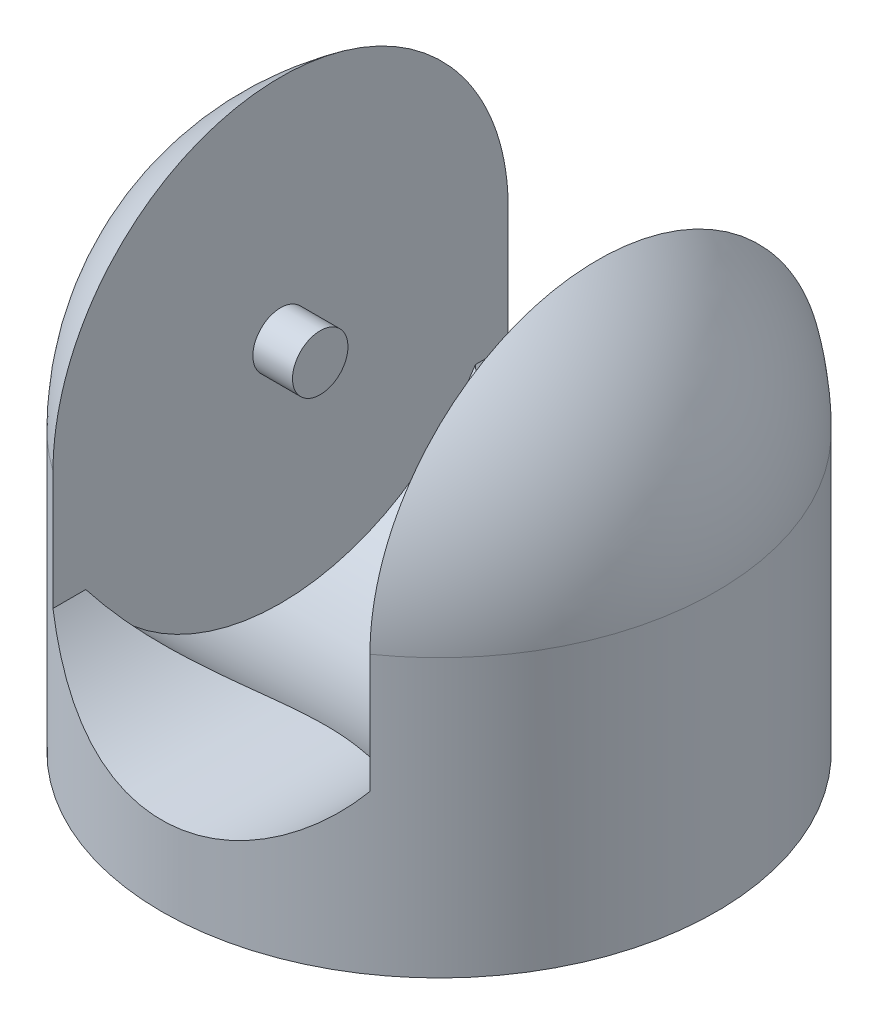
ISO-10303-21;
HEADER;
FILE_DESCRIPTION(('STEP AP214'),'2;1');
FILE_NAME('part.step','',(''),(''),'','','');
FILE_SCHEMA(('AUTOMOTIVE_DESIGN { 1 0 10303 214 1 1 1 1 }'));
ENDSEC;
DATA;
#1=APPLICATION_CONTEXT('core data for automotive mechanical design processes');
#2=APPLICATION_PROTOCOL_DEFINITION('international standard','automotive_design',2000,#1);
#3=PRODUCT_CONTEXT('',#1,'mechanical');
#4=PRODUCT('Part','Part','',(#3));
#5=PRODUCT_RELATED_PRODUCT_CATEGORY('part','',(#4));
#6=PRODUCT_DEFINITION_FORMATION('','',#4);
#7=PRODUCT_DEFINITION_CONTEXT('part definition',#1,'design');
#8=PRODUCT_DEFINITION('design','',#6,#7);
#9=PRODUCT_DEFINITION_SHAPE('','',#8);
#10=(LENGTH_UNIT() NAMED_UNIT(*) SI_UNIT(.MILLI.,.METRE.));
#11=(NAMED_UNIT(*) PLANE_ANGLE_UNIT() SI_UNIT($,.RADIAN.));
#12=(NAMED_UNIT(*) SI_UNIT($,.STERADIAN.) SOLID_ANGLE_UNIT());
#13=UNCERTAINTY_MEASURE_WITH_UNIT(LENGTH_MEASURE(1.E-05),#10,'distance_accuracy_value','');
#14=(GEOMETRIC_REPRESENTATION_CONTEXT(3) GLOBAL_UNCERTAINTY_ASSIGNED_CONTEXT((#13)) GLOBAL_UNIT_ASSIGNED_CONTEXT((#10,
#11,#12)) REPRESENTATION_CONTEXT('',''));
#15=CARTESIAN_POINT('',(0.,0.,0.));
#16=DIRECTION('',(0.,0.,1.));
#17=DIRECTION('',(1.,0.,0.));
#18=AXIS2_PLACEMENT_3D('',#15,#16,#17);
#19=CARTESIAN_POINT('',(-4.57186783672045,31.8336218048073,-6.56611171593209));
#20=DIRECTION('',(-1.,0.,0.));
#21=DIRECTION('',(0.,0.,1.));
#22=AXIS2_PLACEMENT_3D('',#19,#20,#21);
#23=PLANE('',#22);
#24=DIRECTION('',(0.,-1.,0.));
#25=VECTOR('',#24,1.);
#26=CARTESIAN_POINT('',(-4.57186783672045,31.8336218048073,6.56595849405385));
#27=LINE('',#26,#25);
#28=CARTESIAN_POINT('',(-4.57186783672044,23.8326218048073,6.56595849405385));
#29=VERTEX_POINT('',#28);
#30=CARTESIAN_POINT('',(-4.57186783672044,20.4036218048073,6.56595849405385));
#31=VERTEX_POINT('',#30);
#32=EDGE_CURVE('E123',#29,#31,#27,.T.);
#33=ORIENTED_EDGE('',*,*,#32,.T.);
#34=DIRECTION('',(0.,0.,1.));
#35=VECTOR('',#34,1.);
#36=CARTESIAN_POINT('',(-4.57186783672045,20.4036218048073,-8.00130521093912));
#37=LINE('',#36,#35);
#38=CARTESIAN_POINT('',(-4.57186783672045,20.4036218048073,5.6198563165248));
#39=VERTEX_POINT('',#38);
#40=EDGE_CURVE('E111',#39,#31,#37,.T.);
#41=ORIENTED_EDGE('',*,*,#40,.F.);
#42=CARTESIAN_POINT('',(-4.57186783672045,23.8326218048073,-7.66109391214379E-05));
#43=DIRECTION('',(1.,0.,0.));
#44=DIRECTION('',(0.,0.,-1.));
#45=AXIS2_PLACEMENT_3D('',#42,#43,#44);
#46=CIRCLE('',#45,6.58344037029221);
#47=CARTESIAN_POINT('',(-4.57186783672045,20.4036218048073,-5.62000953840304));
#48=VERTEX_POINT('',#47);
#49=EDGE_CURVE('E96',#39,#48,#46,.T.);
#50=ORIENTED_EDGE('',*,*,#49,.T.);
#51=CARTESIAN_POINT('',(-4.57186783672044,20.4036218048073,-6.56611171593209));
#52=VERTEX_POINT('',#51);
#53=EDGE_CURVE('E105',#52,#48,#37,.T.);
#54=ORIENTED_EDGE('',*,*,#53,.F.);
#55=DIRECTION('',(0.,-1.,0.));
#56=VECTOR('',#55,1.);
#57=CARTESIAN_POINT('',(-4.57186783672045,31.8336218048073,-6.56611171593209));
#58=LINE('',#57,#56);
#59=CARTESIAN_POINT('',(-4.57186783672045,23.8326218048073,-6.56611171593209));
#60=VERTEX_POINT('',#59);
#61=EDGE_CURVE('E59',#60,#52,#58,.T.);
#62=ORIENTED_EDGE('',*,*,#61,.F.);
#63=CARTESIAN_POINT('',(-4.57186783672044,23.8326218048073,-7.66109391198517E-05));
#64=DIRECTION('',(-1.,0.,0.));
#65=DIRECTION('',(0.,0.,1.));
#66=AXIS2_PLACEMENT_3D('',#63,#64,#65);
#67=CIRCLE('',#66,6.56603510499297);
#68=EDGE_CURVE('E132',#60,#29,#67,.F.);
#69=ORIENTED_EDGE('',*,*,#68,.T.);
#70=EDGE_LOOP('',(#33,#41,#50,#54,#62,#69));
#71=FACE_BOUND('',#70,.T.);
#72=CARTESIAN_POINT('',(-4.57186783672045,23.8326218048073,-7.66109391198517E-05));
#73=DIRECTION('',(-1.,0.,0.));
#74=DIRECTION('',(0.,0.,1.));
#75=AXIS2_PLACEMENT_3D('',#72,#73,#74);
#76=CIRCLE('',#75,0.8001);
#77=CARTESIAN_POINT('',(-4.57186783672045,23.8326218048073,0.80002338906088));
#78=VERTEX_POINT('',#77);
#79=EDGE_CURVE('E11',#78,#78,#76,.F.);
#80=ORIENTED_EDGE('',*,*,#79,.F.);
#81=EDGE_LOOP('',(#80));
#82=FACE_BOUND('',#81,.T.);
#83=ADVANCED_FACE('F36',(#71,#82),#23,.F.);
#84=CARTESIAN_POINT('',(4.57213216327955,31.8336218048073,-6.56611171593209));
#85=DIRECTION('',(1.,0.,0.));
#86=DIRECTION('',(0.,0.,-1.));
#87=AXIS2_PLACEMENT_3D('',#84,#85,#86);
#88=PLANE('',#87);
#89=DIRECTION('',(0.,-1.,0.));
#90=VECTOR('',#89,1.);
#91=CARTESIAN_POINT('',(4.57213216327955,31.8336218048073,-6.56611171593209));
#92=LINE('',#91,#90);
#93=CARTESIAN_POINT('',(4.57213216327955,23.8326218048073,-6.56611171593209));
#94=VERTEX_POINT('',#93);
#95=CARTESIAN_POINT('',(4.57213216327955,20.4036218048073,-6.56611171593209));
#96=VERTEX_POINT('',#95);
#97=EDGE_CURVE('E110',#94,#96,#92,.T.);
#98=ORIENTED_EDGE('',*,*,#97,.T.);
#99=DIRECTION('',(0.,0.,1.));
#100=VECTOR('',#99,1.);
#101=CARTESIAN_POINT('',(4.57213216327955,20.4036218048073,-8.00130521093912));
#102=LINE('',#101,#100);
#103=CARTESIAN_POINT('',(4.57213216327956,20.4036218048073,-5.62000953840304));
#104=VERTEX_POINT('',#103);
#105=EDGE_CURVE('E103',#96,#104,#102,.T.);
#106=ORIENTED_EDGE('',*,*,#105,.T.);
#107=CARTESIAN_POINT('',(4.57213216327956,23.8326218048073,-7.66109391225424E-05));
#108=DIRECTION('',(1.,0.,0.));
#109=DIRECTION('',(0.,0.,-1.));
#110=AXIS2_PLACEMENT_3D('',#107,#108,#109);
#111=CIRCLE('',#110,6.58344037029221);
#112=CARTESIAN_POINT('',(4.57213216327955,20.4036218048073,5.6198563165248));
#113=VERTEX_POINT('',#112);
#114=EDGE_CURVE('E51',#113,#104,#111,.T.);
#115=ORIENTED_EDGE('',*,*,#114,.F.);
#116=CARTESIAN_POINT('',(4.57213216327955,20.4036218048073,6.56595849405385));
#117=VERTEX_POINT('',#116);
#118=EDGE_CURVE('E112',#113,#117,#102,.T.);
#119=ORIENTED_EDGE('',*,*,#118,.T.);
#120=DIRECTION('',(0.,-1.,0.));
#121=VECTOR('',#120,1.);
#122=CARTESIAN_POINT('',(4.57213216327956,31.8336218048073,6.56595849405385));
#123=LINE('',#122,#121);
#124=CARTESIAN_POINT('',(4.57213216327955,23.8326218048073,6.56595849405385));
#125=VERTEX_POINT('',#124);
#126=EDGE_CURVE('E118',#125,#117,#123,.T.);
#127=ORIENTED_EDGE('',*,*,#126,.F.);
#128=CARTESIAN_POINT('',(4.57213216327955,23.8326218048073,-7.66109391209562E-05));
#129=DIRECTION('',(1.,0.,0.));
#130=DIRECTION('',(0.,0.,-1.));
#131=AXIS2_PLACEMENT_3D('',#128,#129,#130);
#132=CIRCLE('',#131,6.56603510499297);
#133=EDGE_CURVE('E134',#125,#94,#132,.F.);
#134=ORIENTED_EDGE('',*,*,#133,.T.);
#135=EDGE_LOOP('',(#98,#106,#115,#119,#127,#134));
#136=FACE_BOUND('',#135,.T.);
#137=CARTESIAN_POINT('',(4.57213216327955,23.8326218048073,-7.66109391209562E-05));
#138=DIRECTION('',(1.,0.,0.));
#139=DIRECTION('',(0.,0.,-1.));
#140=AXIS2_PLACEMENT_3D('',#137,#138,#139);
#141=CIRCLE('',#140,0.8001);
#142=CARTESIAN_POINT('',(4.57213216327955,23.8326218048073,-0.800176610939121));
#143=VERTEX_POINT('',#142);
#144=EDGE_CURVE('E44',#143,#143,#141,.F.);
#145=ORIENTED_EDGE('',*,*,#144,.F.);
#146=EDGE_LOOP('',(#145));
#147=FACE_BOUND('',#146,.T.);
#148=ADVANCED_FACE('F107',(#136,#147),#88,.F.);
#149=CARTESIAN_POINT('',(0.000132163279554029,23.8326218048073,-8.00130521093912));
#150=DIRECTION('',(0.,0.,1.));
#151=DIRECTION('',(1.,0.,0.));
#152=AXIS2_PLACEMENT_3D('',#149,#150,#151);
#153=CYLINDRICAL_SURFACE('',#152,5.715);
#154=CARTESIAN_POINT('',(4.57213216327956,20.4036218048073,-5.62000953840304));
#155=CARTESIAN_POINT('',(4.46187387850349,20.2566852475342,-5.53037015461616));
#156=CARTESIAN_POINT('',(4.3457878819167,20.1165901241571,-5.43697290801031));
#157=CARTESIAN_POINT('',(4.10295298374768,19.8500728341516,-5.24487514427183));
#158=CARTESIAN_POINT('',(3.97620967313423,19.7236435768166,-5.14617741754067));
#159=CARTESIAN_POINT('',(3.71186332845372,19.4833200916054,-4.94477610392658));
#160=CARTESIAN_POINT('',(3.57418023409407,19.3695363757518,-4.8420464326243));
#161=CARTESIAN_POINT('',(3.28923801537672,19.1555749465828,-4.63569773895956));
#162=CARTESIAN_POINT('',(3.14197928832171,19.055396669296,-4.53207875365028));
#163=CARTESIAN_POINT('',(2.87552723227134,18.8918398549618,-4.35223243709056));
#164=CARTESIAN_POINT('',(2.75842791052056,18.8254955521383,-4.27558347688336));
#165=CARTESIAN_POINT('',(2.51852813606625,18.7006443250377,-4.12488664139121));
#166=CARTESIAN_POINT('',(2.39572885422772,18.6421358006737,-4.05083823735116));
#167=CARTESIAN_POINT('',(2.14434606431652,18.5333499516859,-3.90743842066485));
#168=CARTESIAN_POINT('',(2.01577860494701,18.4830513999735,-3.8380751759613));
#169=CARTESIAN_POINT('',(1.75217211785867,18.3910180729562,-3.70643416352567));
#170=CARTESIAN_POINT('',(1.61713721149171,18.3492779311043,-3.64415196660992));
#171=CARTESIAN_POINT('',(1.31408385692659,18.2681094704148,-3.51922519790924));
#172=CARTESIAN_POINT('',(1.14463778094293,18.2305916494721,-3.4587145847365));
#173=CARTESIAN_POINT('',(0.79691775983565,18.1707143803159,-3.35982979505504));
#174=CARTESIAN_POINT('',(0.618670390961418,18.1483119736887,-3.32139293109974));
#175=CARTESIAN_POINT('',(0.346460203585758,18.1273823255636,-3.28520903401563));
#176=CARTESIAN_POINT('',(0.254335130770877,18.1225282119759,-3.27674192914511));
#177=CARTESIAN_POINT('',(0.0695551943992941,18.1172978465821,-3.26761347825821));
#178=CARTESIAN_POINT('',(-0.0230996300055934,18.1169212680321,-3.26695156266545));
#179=CARTESIAN_POINT('',(-0.208072364894372,18.1206656598221,-3.27349302869336));
#180=CARTESIAN_POINT('',(-0.300390108325046,18.1247886185373,-3.28069988757795));
#181=CARTESIAN_POINT('',(-0.483871490169672,18.1374107010838,-3.30256273529336));
#182=CARTESIAN_POINT('',(-0.575034440364175,18.1459123193281,-3.31722297006477));
#183=CARTESIAN_POINT('',(-0.770627461835221,18.1688417096964,-3.35624625073993));
#184=CARTESIAN_POINT('',(-0.874725451927421,18.1840229881755,-3.3818222708444));
#185=CARTESIAN_POINT('',(-1.07987052630679,18.2196300937725,-3.44059796620617));
#186=CARTESIAN_POINT('',(-1.18091503188239,18.2400602225097,-3.47380389207296));
#187=CARTESIAN_POINT('',(-1.37998271481951,18.2858230386565,-3.54642051614258));
#188=CARTESIAN_POINT('',(-1.47799447624548,18.3111721269164,-3.585851886952));
#189=CARTESIAN_POINT('',(-1.67060915854622,18.3663724258302,-3.66945246213082));
#190=CARTESIAN_POINT('',(-1.76521284375485,18.3962226191291,-3.71362059523134));
#191=CARTESIAN_POINT('',(-2.01815992226182,18.4831956979442,-3.83863917809185));
#192=CARTESIAN_POINT('',(-2.17334626896495,18.5444790457216,-3.92300150409558));
#193=CARTESIAN_POINT('',(-2.47499386041221,18.6787639593691,-4.09783572032648));
#194=CARTESIAN_POINT('',(-2.62144867138352,18.7517740231712,-4.18831201337319));
#195=CARTESIAN_POINT('',(-2.90618276957018,18.9091071186027,-4.37218466242924));
#196=CARTESIAN_POINT('',(-3.0444631379859,18.9934286492652,-4.46558062975559));
#197=CARTESIAN_POINT('',(-3.31306171799542,19.1732141836919,-4.6528691275784));
#198=CARTESIAN_POINT('',(-3.44338305586208,19.2686737690317,-4.74676144715721));
#199=CARTESIAN_POINT('',(-3.75510072636047,19.5180213115988,-4.97667308988142));
#200=CARTESIAN_POINT('',(-3.93198269342912,19.6784006484207,-5.11192448146004));
#201=CARTESIAN_POINT('',(-4.18307371327773,19.9369342776569,-5.30827873899445));
#202=CARTESIAN_POINT('',(-4.26430592310577,20.0259836174216,-5.37256661873096));
#203=CARTESIAN_POINT('',(-4.42185821427533,20.2102048350139,-5.49845997670177));
#204=CARTESIAN_POINT('',(-4.49817598303775,20.3053795537348,-5.56006418773968));
#205=CARTESIAN_POINT('',(-4.57186783672045,20.4036218048073,-5.62000953840304));
#206=B_SPLINE_CURVE_WITH_KNOTS('',3,(#154,#155,#156,#157,#158,#159,#160,#161,#162,#163,#164,
#165,#166,#167,#168,#169,#170,#171,#172,#173,#174,#175,#176,#177,#178,#179,#180,#181,#182,#183,
#184,#185,#186,#187,#188,#189,#190,#191,#192,#193,#194,#195,#196,#197,#198,#199,#200,#201,#202,
#203,#204,#205),.UNSPECIFIED.,.F.,.F.,(4,2,2,2,2,2,2,2,2,2,2,2,2,2,2,2,2,2,2,2,2,2,2,2,2,4),(0.,
0.612810014522095,1.22530052290379,1.84278088953668,2.46023565261067,2.92459973679603,
3.38886885153179,3.85191789175661,4.31467568329198,4.8644476564025,5.4126505062687,
5.69018726195104,5.96770376452344,6.24534295314193,6.52314048109657,6.84741489398671,
7.17195591374848,7.49759821493089,7.82316702335746,8.38317719481423,8.94359503192337,
9.50393857821987,10.0640605892982,10.8853207901664,11.2949268386783,11.7047242470596),.UNSPECIFIED.);
#207=EDGE_CURVE('E90',#104,#48,#206,.T.);
#208=ORIENTED_EDGE('',*,*,#207,.F.);
#209=ORIENTED_EDGE('',*,*,#105,.F.);
#210=CARTESIAN_POINT('',(4.57213216327956,20.4036218048073,-6.56611171593209));
#211=CARTESIAN_POINT('',(4.4746559325398,20.2736910840838,-6.63400363021865));
#212=CARTESIAN_POINT('',(4.37179243314487,20.1480456456083,-6.70238786733606));
#213=CARTESIAN_POINT('',(4.15550006441228,19.9057138327933,-6.83858492151414));
#214=CARTESIAN_POINT('',(4.04206491865612,19.7890328566413,-6.90639737271691));
#215=CARTESIAN_POINT('',(3.80375223966296,19.5640387731431,-7.04048690190543));
#216=CARTESIAN_POINT('',(3.67877025286319,19.4558226200812,-7.10674140973968));
#217=CARTESIAN_POINT('',(3.41868579619101,19.2498021552409,-7.2354435253314));
#218=CARTESIAN_POINT('',(3.28358482959208,19.1519963021168,-7.29789169606719));
#219=CARTESIAN_POINT('',(3.00297480032949,18.9671804741064,-7.41778040597541));
#220=CARTESIAN_POINT('',(2.85741733344583,18.8802265876315,-7.4751945065604));
#221=CARTESIAN_POINT('',(2.55715909537866,18.718730493987,-7.58315344323584));
#222=CARTESIAN_POINT('',(2.40246004941343,18.6441859549708,-7.63369956956189));
#223=CARTESIAN_POINT('',(2.08549341416024,18.5088958046853,-7.72629254189141));
#224=CARTESIAN_POINT('',(1.9232599672923,18.4480941095009,-7.76837385203307));
#225=CARTESIAN_POINT('',(1.59194176260776,18.3410235785492,-7.84296827598671));
#226=CARTESIAN_POINT('',(1.42285873074591,18.2947511071176,-7.87548378333184));
#227=CARTESIAN_POINT('',(1.10425099058226,18.2232690751801,-7.92592499792437));
#228=CARTESIAN_POINT('',(0.955414440896752,18.1959863728852,-7.94527711694353));
#229=CARTESIAN_POINT('',(0.655219270875694,18.1532680865494,-7.97563973133785));
#230=CARTESIAN_POINT('',(0.503861086227046,18.1378304771698,-7.98665165276138));
#231=CARTESIAN_POINT('',(0.199990973415809,18.1190887897849,-8.0000261544256));
#232=CARTESIAN_POINT('',(0.0474788710934799,18.1157865815083,-8.00238740183723));
#233=CARTESIAN_POINT('',(-0.257199950556427,18.1213860565831,-7.99838799951632));
#234=CARTESIAN_POINT('',(-0.409366697098464,18.1302867423399,-7.99202806274631));
#235=CARTESIAN_POINT('',(-0.691883221737035,18.1581397775773,-7.97218066523898));
#236=CARTESIAN_POINT('',(-0.822457568760648,18.175607579322,-7.95974672975834));
#237=CARTESIAN_POINT('',(-1.08141549670381,18.2193582700289,-7.9287124053831));
#238=CARTESIAN_POINT('',(-1.20979841242458,18.2456437872661,-7.91011017793996));
#239=CARTESIAN_POINT('',(-1.46345031481169,18.3066691574024,-7.86712553620073));
#240=CARTESIAN_POINT('',(-1.58872140743594,18.3414031108803,-7.84274715561527));
#241=CARTESIAN_POINT('',(-1.83558636625185,18.4189239036312,-7.78866673042543));
#242=CARTESIAN_POINT('',(-1.95717885358667,18.4617137201304,-7.75896271780761));
#243=CARTESIAN_POINT('',(-2.32551125538776,18.6053987685259,-7.65994843645307));
#244=CARTESIAN_POINT('',(-2.56524791535507,18.7190536117173,-7.58257040293873));
#245=CARTESIAN_POINT('',(-3.02277157531581,18.9754335295164,-7.41208476116729));
#246=CARTESIAN_POINT('',(-3.24052599191186,19.1182008372206,-7.31895433496169));
#247=CARTESIAN_POINT('',(-3.55375717333761,19.3549762229122,-7.16946487745253));
#248=CARTESIAN_POINT('',(-3.65807342603239,19.4398186366625,-7.11672010248554));
#249=CARTESIAN_POINT('',(-3.85994423372628,19.6161081607154,-7.00927610217346));
#250=CARTESIAN_POINT('',(-3.95749815877714,19.7075558847232,-6.95457669546097));
#251=CARTESIAN_POINT('',(-4.14529790568727,19.8963409108482,-6.84428720925269));
#252=CARTESIAN_POINT('',(-4.23557026430893,19.9936543368048,-6.78870133897031));
#253=CARTESIAN_POINT('',(-4.40904762864331,20.194229348681,-6.67733527051946));
#254=CARTESIAN_POINT('',(-4.49225459121562,20.2974892742509,-6.62155513064155));
#255=CARTESIAN_POINT('',(-4.57186783672045,20.4036218048073,-6.56611171593209));
#256=B_SPLINE_CURVE_WITH_KNOTS('',3,(#210,#211,#212,#213,#214,#215,#216,#217,#218,#219,#220,
#221,#222,#223,#224,#225,#226,#227,#228,#229,#230,#231,#232,#233,#234,#235,#236,#237,#238,#239,
#240,#241,#242,#243,#244,#245,#246,#247,#248,#249,#250,#251,#252,#253,#254,#255),.UNSPECIFIED.,
.F.,.F.,(4,2,2,2,2,2,2,2,2,2,2,2,2,2,2,2,2,2,2,2,2,2,4),(0.,0.528026178205378,1.05636786888378,
1.59007221050454,2.12369742178673,2.65997552140407,3.19615273471007,3.73010065451932,
4.26391485725443,4.72088819351915,5.17778337656415,5.63474895153109,6.09167717148988,
6.4881935162415,6.88482815481649,7.28118662027708,7.67769185753722,8.50339250182908,
9.33029961219006,9.7633389930182,10.1964186598013,10.6278411010329,11.0591436614155),.UNSPECIFIED.);
#257=EDGE_CURVE('E125',#96,#52,#256,.T.);
#258=ORIENTED_EDGE('',*,*,#257,.T.);
#259=ORIENTED_EDGE('',*,*,#53,.T.);
#260=EDGE_LOOP('',(#208,#209,#258,#259));
#261=FACE_BOUND('',#260,.T.);
#262=ADVANCED_FACE('F101',(#261),#153,.F.);
#263=CARTESIAN_POINT('',(-4.57186783672045,20.4036218048073,5.6198563165248));
#264=CARTESIAN_POINT('',(-4.46160955194438,20.2566852475342,5.53021693273792));
#265=CARTESIAN_POINT('',(-4.34552355535759,20.1165901241571,5.43681968613207));
#266=CARTESIAN_POINT('',(-4.10268865718857,19.8500728341516,5.24472192239359));
#267=CARTESIAN_POINT('',(-3.97594534657513,19.7236435768166,5.14602419566243));
#268=CARTESIAN_POINT('',(-3.71159900189462,19.4833200916054,4.94462288204834));
#269=CARTESIAN_POINT('',(-3.57391590753497,19.3695363757518,4.84189321074606));
#270=CARTESIAN_POINT('',(-3.28897368881761,19.1555749465828,4.63554451708132));
#271=CARTESIAN_POINT('',(-3.1417149617626,19.0553966692961,4.53192553177204));
#272=CARTESIAN_POINT('',(-2.87526290571223,18.8918398549618,4.35207921521232));
#273=CARTESIAN_POINT('',(-2.75816358396145,18.8254955521383,4.27543025500512));
#274=CARTESIAN_POINT('',(-2.51826380950714,18.7006443250377,4.12473341951297));
#275=CARTESIAN_POINT('',(-2.39546452766861,18.6421358006737,4.05068501547292));
#276=CARTESIAN_POINT('',(-2.14408173775741,18.5333499516859,3.9072851987866));
#277=CARTESIAN_POINT('',(-2.0155142783879,18.4830513999735,3.83792195408305));
#278=CARTESIAN_POINT('',(-1.75190779129956,18.3910180729562,3.70628094164743));
#279=CARTESIAN_POINT('',(-1.6168728849326,18.3492779311043,3.64399874473167));
#280=CARTESIAN_POINT('',(-1.31381953036749,18.2681094704148,3.51907197603099));
#281=CARTESIAN_POINT('',(-1.14437345438382,18.2305916494721,3.45856136285826));
#282=CARTESIAN_POINT('',(-0.796653433276543,18.1707143803159,3.3596765731768));
#283=CARTESIAN_POINT('',(-0.61840606440231,18.1483119736887,3.32123970922149));
#284=CARTESIAN_POINT('',(-0.34619587702665,18.1273823255636,3.28505581213738));
#285=CARTESIAN_POINT('',(-0.254070804211769,18.1225282119759,3.27658870726687));
#286=CARTESIAN_POINT('',(-0.0692908678401863,18.1172978465821,3.26746025637997));
#287=CARTESIAN_POINT('',(0.0233639565647013,18.1169212680321,3.2667983407872));
#288=CARTESIAN_POINT('',(0.208336691453479,18.1206656598221,3.27333980681512));
#289=CARTESIAN_POINT('',(0.300654434884153,18.1247886185373,3.2805466656997));
#290=CARTESIAN_POINT('',(0.48413581672878,18.1374107010838,3.30240951341512));
#291=CARTESIAN_POINT('',(0.575298766923283,18.1459123193281,3.31706974818653));
#292=CARTESIAN_POINT('',(0.770891788394328,18.1688417096964,3.35609302886169));
#293=CARTESIAN_POINT('',(0.874989778486528,18.1840229881755,3.38166904896616));
#294=CARTESIAN_POINT('',(1.08013485286589,18.2196300937725,3.44044474432793));
#295=CARTESIAN_POINT('',(1.1811793584415,18.2400602225097,3.47365067019472));
#296=CARTESIAN_POINT('',(1.38024704137862,18.2858230386565,3.54626729426434));
#297=CARTESIAN_POINT('',(1.47825880280459,18.3111721269164,3.58569866507376));
#298=CARTESIAN_POINT('',(1.67087348510533,18.3663724258302,3.66929924025258));
#299=CARTESIAN_POINT('',(1.76547717031396,18.3962226191291,3.7134673733531));
#300=CARTESIAN_POINT('',(2.01842424882093,18.4831956979442,3.83848595621361));
#301=CARTESIAN_POINT('',(2.17361059552406,18.5444790457216,3.92284828221734));
#302=CARTESIAN_POINT('',(2.47525818697132,18.6787639593691,4.09768249844824));
#303=CARTESIAN_POINT('',(2.62171299794263,18.7517740231712,4.18815879149494));
#304=CARTESIAN_POINT('',(2.90644709612929,18.9091071186027,4.37203144055099));
#305=CARTESIAN_POINT('',(3.04472746454501,18.9934286492652,4.46542740787735));
#306=CARTESIAN_POINT('',(3.31332604455453,19.1732141836919,4.65271590570016));
#307=CARTESIAN_POINT('',(3.44364738242119,19.2686737690317,4.74660822527897));
#308=CARTESIAN_POINT('',(3.75536505291957,19.5180213115988,4.97651986800318));
#309=CARTESIAN_POINT('',(3.93224701998823,19.6784006484207,5.11177125958179));
#310=CARTESIAN_POINT('',(4.18333803983684,19.9369342776569,5.30812551711621));
#311=CARTESIAN_POINT('',(4.26457024966488,20.0259836174216,5.37241339685271));
#312=CARTESIAN_POINT('',(4.42212254083444,20.2102048350139,5.49830675482352));
#313=CARTESIAN_POINT('',(4.49844030959685,20.3053795537348,5.55991096586143));
#314=CARTESIAN_POINT('',(4.57213216327956,20.4036218048073,5.6198563165248));
#315=B_SPLINE_CURVE_WITH_KNOTS('',3,(#263,#264,#265,#266,#267,#268,#269,#270,#271,#272,#273,
#274,#275,#276,#277,#278,#279,#280,#281,#282,#283,#284,#285,#286,#287,#288,#289,#290,#291,#292,
#293,#294,#295,#296,#297,#298,#299,#300,#301,#302,#303,#304,#305,#306,#307,#308,#309,#310,#311,
#312,#313,#314),.UNSPECIFIED.,.F.,.F.,(4,2,2,2,2,2,2,2,2,2,2,2,2,2,2,2,2,2,2,2,2,2,2,2,2,4),(0.,
0.612810014522093,1.22530052290379,1.84278088953668,2.46023565261066,2.92459973679603,
3.38886885153179,3.85191789175661,4.31467568329198,4.8644476564025,5.4126505062687,
5.69018726195104,5.96770376452344,6.24534295314194,6.52314048109657,6.84741489398671,
7.17195591374848,7.49759821493089,7.82316702335746,8.38317719481423,8.94359503192338,
9.50393857821988,10.0640605892982,10.8853207901664,11.2949268386783,11.7047242470596),.UNSPECIFIED.);
#316=EDGE_CURVE('E93',#39,#113,#315,.T.);
#317=ORIENTED_EDGE('',*,*,#316,.F.);
#318=ORIENTED_EDGE('',*,*,#40,.T.);
#319=CARTESIAN_POINT('',(4.57213216327956,20.4036218048073,6.56595849405385));
#320=CARTESIAN_POINT('',(4.4746559325398,20.2736910840838,6.63385040834041));
#321=CARTESIAN_POINT('',(4.37179243314487,20.1480456456083,6.70223464545781));
#322=CARTESIAN_POINT('',(4.15550006441228,19.9057138327933,6.8384316996359));
#323=CARTESIAN_POINT('',(4.04206491865612,19.7890328566413,6.90624415083867));
#324=CARTESIAN_POINT('',(3.80375223966296,19.5640387731431,7.0403336800272));
#325=CARTESIAN_POINT('',(3.67877025286319,19.4558226200812,7.10658818786144));
#326=CARTESIAN_POINT('',(3.41868579619101,19.2498021552409,7.23529030345316));
#327=CARTESIAN_POINT('',(3.28358482959208,19.1519963021168,7.29773847418894));
#328=CARTESIAN_POINT('',(3.00297480032949,18.9671804741064,7.41762718409716));
#329=CARTESIAN_POINT('',(2.85741733344583,18.8802265876315,7.47504128468215));
#330=CARTESIAN_POINT('',(2.55715909537866,18.718730493987,7.5830002213576));
#331=CARTESIAN_POINT('',(2.40246004941344,18.6441859549708,7.63354634768365));
#332=CARTESIAN_POINT('',(2.08549341416024,18.5088958046853,7.72613932001317));
#333=CARTESIAN_POINT('',(1.9232599672923,18.4480941095009,7.76822063015483));
#334=CARTESIAN_POINT('',(1.59194176260776,18.3410235785492,7.84281505410847));
#335=CARTESIAN_POINT('',(1.42285873074592,18.2947511071176,7.8753305614536));
#336=CARTESIAN_POINT('',(1.10425099058226,18.2232690751801,7.92577177604613));
#337=CARTESIAN_POINT('',(0.955414440896754,18.1959863728852,7.94512389506529));
#338=CARTESIAN_POINT('',(0.655219270875695,18.1532680865494,7.97548650945961));
#339=CARTESIAN_POINT('',(0.503861086227048,18.1378304771698,7.98649843088314));
#340=CARTESIAN_POINT('',(0.19999097341581,18.1190887897849,7.99987293254735));
#341=CARTESIAN_POINT('',(0.0474788710934806,18.1157865815083,8.00223417995899));
#342=CARTESIAN_POINT('',(-0.257199950556426,18.1213860565831,7.99823477763808));
#343=CARTESIAN_POINT('',(-0.409366697098464,18.1302867423399,7.99187484086807));
#344=CARTESIAN_POINT('',(-0.691883221737034,18.1581397775773,7.97202744336074));
#345=CARTESIAN_POINT('',(-0.822457568760647,18.175607579322,7.9595935078801));
#346=CARTESIAN_POINT('',(-1.08141549670381,18.2193582700289,7.92855918350486));
#347=CARTESIAN_POINT('',(-1.20979841242458,18.245643787266,7.90995695606172));
#348=CARTESIAN_POINT('',(-1.46345031481169,18.3066691574024,7.86697231432249));
#349=CARTESIAN_POINT('',(-1.58872140743594,18.3414031108803,7.84259393373703));
#350=CARTESIAN_POINT('',(-1.83558636625185,18.4189239036312,7.78851350854719));
#351=CARTESIAN_POINT('',(-1.95717885358667,18.4617137201304,7.75880949592937));
#352=CARTESIAN_POINT('',(-2.32551125538776,18.6053987685259,7.65979521457483));
#353=CARTESIAN_POINT('',(-2.56524791535507,18.7190536117173,7.58241718106049));
#354=CARTESIAN_POINT('',(-3.02277157531581,18.9754335295164,7.41193153928905));
#355=CARTESIAN_POINT('',(-3.24052599191186,19.1182008372206,7.31880111308344));
#356=CARTESIAN_POINT('',(-3.55375717333761,19.3549762229122,7.16931165557429));
#357=CARTESIAN_POINT('',(-3.65807342603239,19.4398186366625,7.1165668806073));
#358=CARTESIAN_POINT('',(-3.85994423372628,19.6161081607154,7.00912288029522));
#359=CARTESIAN_POINT('',(-3.95749815877714,19.7075558847232,6.95442347358273));
#360=CARTESIAN_POINT('',(-4.14529790568727,19.8963409108482,6.84413398737446));
#361=CARTESIAN_POINT('',(-4.23557026430893,19.9936543368048,6.78854811709207));
#362=CARTESIAN_POINT('',(-4.40904762864331,20.194229348681,6.67718204864122));
#363=CARTESIAN_POINT('',(-4.49225459121562,20.2974892742509,6.62140190876331));
#364=CARTESIAN_POINT('',(-4.57186783672045,20.4036218048073,6.56595849405385));
#365=B_SPLINE_CURVE_WITH_KNOTS('',3,(#319,#320,#321,#322,#323,#324,#325,#326,#327,#328,#329,
#330,#331,#332,#333,#334,#335,#336,#337,#338,#339,#340,#341,#342,#343,#344,#345,#346,#347,#348,
#349,#350,#351,#352,#353,#354,#355,#356,#357,#358,#359,#360,#361,#362,#363,#364),.UNSPECIFIED.,
.F.,.F.,(4,2,2,2,2,2,2,2,2,2,2,2,2,2,2,2,2,2,2,2,2,2,4),(0.,0.528026178205381,1.05636786888378,
1.59007221050454,2.12369742178672,2.65997552140407,3.19615273471007,3.73010065451932,
4.26391485725443,4.72088819351915,5.17778337656415,5.63474895153109,6.09167717148987,
6.4881935162415,6.88482815481649,7.28118662027708,7.67769185753722,8.50339250182908,
9.33029961219006,9.7633389930182,10.1964186598013,10.6278411010328,11.0591436614155),.UNSPECIFIED.);
#366=EDGE_CURVE('E95',#117,#31,#365,.T.);
#367=ORIENTED_EDGE('',*,*,#366,.F.);
#368=ORIENTED_EDGE('',*,*,#118,.F.);
#369=EDGE_LOOP('',(#317,#318,#367,#368));
#370=FACE_BOUND('',#369,.T.);
#371=ADVANCED_FACE('F205',(#370),#153,.F.);
#372=CARTESIAN_POINT('',(0.000132163279554029,23.8326218048073,-7.66109391204039E-05));
#373=DIRECTION('',(0.,0.,1.));
#374=DIRECTION('',(1.,0.,0.));
#375=AXIS2_PLACEMENT_3D('',#372,#373,#374);
#376=SPHERICAL_SURFACE('',#375,8.001);
#377=ORIENTED_EDGE('',*,*,#133,.F.);
#378=CARTESIAN_POINT('',(0.000132163279554029,23.8326218048073,-7.66109391204039E-05));
#379=DIRECTION('',(0.,-1.,0.));
#380=DIRECTION('',(0.,0.,-1.));
#381=AXIS2_PLACEMENT_3D('',#378,#379,#380);
#382=CIRCLE('',#381,8.001);
#383=EDGE_CURVE('E129',#94,#125,#382,.T.);
#384=ORIENTED_EDGE('',*,*,#383,.F.);
#385=EDGE_LOOP('',(#377,#384));
#386=FACE_BOUND('',#385,.T.);
#387=ADVANCED_FACE('F201',(#386),#376,.T.);
#388=CARTESIAN_POINT('',(0.000132163279554029,31.8336218048073,-7.66109391204039E-05));
#389=DIRECTION('',(0.,-1.,0.));
#390=DIRECTION('',(0.,0.,-1.));
#391=AXIS2_PLACEMENT_3D('',#388,#389,#390);
#392=CYLINDRICAL_SURFACE('',#391,8.001);
#393=ORIENTED_EDGE('',*,*,#366,.T.);
#394=ORIENTED_EDGE('',*,*,#32,.F.);
#395=EDGE_CURVE('E128',#29,#60,#382,.T.);
#396=ORIENTED_EDGE('',*,*,#395,.T.);
#397=ORIENTED_EDGE('',*,*,#61,.T.);
#398=ORIENTED_EDGE('',*,*,#257,.F.);
#399=ORIENTED_EDGE('',*,*,#97,.F.);
#400=ORIENTED_EDGE('',*,*,#383,.T.);
#401=ORIENTED_EDGE('',*,*,#126,.T.);
#402=EDGE_LOOP('',(#393,#394,#396,#397,#398,#399,#400,#401));
#403=FACE_BOUND('',#402,.T.);
#404=CARTESIAN_POINT('',(0.000132163279554029,15.8316218048073,-7.66109391204039E-05));
#405=DIRECTION('',(0.,1.,0.));
#406=DIRECTION('',(0.,0.,1.));
#407=AXIS2_PLACEMENT_3D('',#404,#405,#406);
#408=CIRCLE('',#407,8.001);
#409=CARTESIAN_POINT('',(0.000132163279554029,15.8316218048073,8.00092338906088));
#410=VERTEX_POINT('',#409);
#411=EDGE_CURVE('E120',#410,#410,#408,.T.);
#412=ORIENTED_EDGE('',*,*,#411,.T.);
#413=EDGE_LOOP('',(#412));
#414=FACE_BOUND('',#413,.T.);
#415=ADVANCED_FACE('F196',(#403,#414),#392,.T.);
#416=CARTESIAN_POINT('',(0.000132163279554029,15.8316218048073,-7.66109391204039E-05));
#417=DIRECTION('',(0.,1.,0.));
#418=DIRECTION('',(0.,0.,1.));
#419=AXIS2_PLACEMENT_3D('',#416,#417,#418);
#420=PLANE('',#419);
#421=CARTESIAN_POINT('',(0.000132163279554029,15.8316218048073,-7.66109391204039E-05));
#422=DIRECTION('',(0.,-1.,0.));
#423=DIRECTION('',(0.,0.,-1.));
#424=AXIS2_PLACEMENT_3D('',#421,#422,#423);
#425=CIRCLE('',#424,0.8001);
#426=CARTESIAN_POINT('',(0.000132163279554029,15.8316218048073,-0.80017661093912));
#427=VERTEX_POINT('',#426);
#428=EDGE_CURVE('E178',#427,#427,#425,.T.);
#429=ORIENTED_EDGE('',*,*,#428,.F.);
#430=EDGE_LOOP('',(#429));
#431=FACE_BOUND('',#430,.T.);
#432=ORIENTED_EDGE('',*,*,#411,.F.);
#433=EDGE_LOOP('',(#432));
#434=FACE_BOUND('',#433,.T.);
#435=ADVANCED_FACE('F193',(#431,#434),#420,.F.);
#436=ORIENTED_EDGE('',*,*,#68,.F.);
#437=ORIENTED_EDGE('',*,*,#395,.F.);
#438=EDGE_LOOP('',(#436,#437));
#439=FACE_BOUND('',#438,.T.);
#440=ADVANCED_FACE('F38',(#439),#376,.T.);
#441=CARTESIAN_POINT('',(23.1929134807631,23.8326218048073,-7.66109391247916E-05));
#442=DIRECTION('',(-1.,0.,0.));
#443=DIRECTION('',(0.,0.,1.));
#444=AXIS2_PLACEMENT_3D('',#441,#442,#443);
#445=CYLINDRICAL_SURFACE('',#444,6.58344037029221);
#446=ORIENTED_EDGE('',*,*,#207,.T.);
#447=ORIENTED_EDGE('',*,*,#49,.F.);
#448=ORIENTED_EDGE('',*,*,#316,.T.);
#449=ORIENTED_EDGE('',*,*,#114,.T.);
#450=EDGE_LOOP('',(#446,#447,#448,#449));
#451=FACE_BOUND('',#450,.T.);
#452=ADVANCED_FACE('F89',(#451),#445,.F.);
#453=CARTESIAN_POINT('',(3.42913216327955,23.8326218048073,-7.66109391208181E-05));
#454=DIRECTION('',(1.,0.,0.));
#455=DIRECTION('',(0.,0.,-1.));
#456=AXIS2_PLACEMENT_3D('',#453,#454,#455);
#457=CYLINDRICAL_SURFACE('',#456,0.8001);
#458=CARTESIAN_POINT('',(3.42913216327955,23.8326218048073,-7.66109391208181E-05));
#459=DIRECTION('',(-1.,0.,0.));
#460=DIRECTION('',(0.,0.,1.));
#461=AXIS2_PLACEMENT_3D('',#458,#459,#460);
#462=CIRCLE('',#461,0.8001);
#463=CARTESIAN_POINT('',(3.42913216327955,23.8326218048073,0.800023389060879));
#464=VERTEX_POINT('',#463);
#465=EDGE_CURVE('E170',#464,#464,#462,.T.);
#466=ORIENTED_EDGE('',*,*,#465,.F.);
#467=EDGE_LOOP('',(#466));
#468=FACE_BOUND('',#467,.T.);
#469=ORIENTED_EDGE('',*,*,#144,.T.);
#470=EDGE_LOOP('',(#469));
#471=FACE_BOUND('',#470,.T.);
#472=ADVANCED_FACE('F151',(#468,#471),#457,.T.);
#473=CARTESIAN_POINT('',(3.42913216327955,23.8326218048073,-7.66109391208181E-05));
#474=DIRECTION('',(-1.,0.,0.));
#475=DIRECTION('',(0.,0.,1.));
#476=AXIS2_PLACEMENT_3D('',#473,#474,#475);
#477=PLANE('',#476);
#478=ORIENTED_EDGE('',*,*,#465,.T.);
#479=EDGE_LOOP('',(#478));
#480=FACE_BOUND('',#479,.T.);
#481=ADVANCED_FACE('F246',(#480),#477,.T.);
#482=CARTESIAN_POINT('',(-4.57186783672045,23.8326218048073,-7.66109391198517E-05));
#483=DIRECTION('',(1.,0.,0.));
#484=DIRECTION('',(0.,0.,-1.));
#485=AXIS2_PLACEMENT_3D('',#482,#483,#484);
#486=CYLINDRICAL_SURFACE('',#485,0.8001);
#487=ORIENTED_EDGE('',*,*,#79,.T.);
#488=EDGE_LOOP('',(#487));
#489=FACE_BOUND('',#488,.T.);
#490=CARTESIAN_POINT('',(-3.42886783672045,23.8326218048073,-7.66109391199898E-05));
#491=DIRECTION('',(-1.,0.,0.));
#492=DIRECTION('',(0.,0.,1.));
#493=AXIS2_PLACEMENT_3D('',#490,#491,#492);
#494=CIRCLE('',#493,0.8001);
#495=CARTESIAN_POINT('',(-3.42886783672045,23.8326218048073,0.80002338906088));
#496=VERTEX_POINT('',#495);
#497=EDGE_CURVE('E172',#496,#496,#494,.T.);
#498=ORIENTED_EDGE('',*,*,#497,.T.);
#499=EDGE_LOOP('',(#498));
#500=FACE_BOUND('',#499,.T.);
#501=ADVANCED_FACE('F254',(#489,#500),#486,.T.);
#502=CARTESIAN_POINT('',(-3.42886783672045,23.8326218048073,-7.66109391199898E-05));
#503=DIRECTION('',(-1.,0.,0.));
#504=DIRECTION('',(0.,0.,1.));
#505=AXIS2_PLACEMENT_3D('',#502,#503,#504);
#506=PLANE('',#505);
#507=ORIENTED_EDGE('',*,*,#497,.F.);
#508=EDGE_LOOP('',(#507));
#509=FACE_BOUND('',#508,.T.);
#510=ADVANCED_FACE('F189',(#509),#506,.F.);
#511=CARTESIAN_POINT('',(0.000132163279554029,16.9746218048073,-7.66109391204039E-05));
#512=DIRECTION('',(0.,-1.,0.));
#513=DIRECTION('',(0.,0.,-1.));
#514=AXIS2_PLACEMENT_3D('',#511,#512,#513);
#515=CYLINDRICAL_SURFACE('',#514,0.8001);
#516=CARTESIAN_POINT('',(0.000132163279554029,16.9746218048073,-7.66109391204039E-05));
#517=DIRECTION('',(0.,-1.,0.));
#518=DIRECTION('',(0.,0.,-1.));
#519=AXIS2_PLACEMENT_3D('',#516,#517,#518);
#520=CIRCLE('',#519,0.8001);
#521=CARTESIAN_POINT('',(0.000132163279554029,16.9746218048073,-0.80017661093912));
#522=VERTEX_POINT('',#521);
#523=EDGE_CURVE('E177',#522,#522,#520,.T.);
#524=ORIENTED_EDGE('',*,*,#523,.F.);
#525=EDGE_LOOP('',(#524));
#526=FACE_BOUND('',#525,.T.);
#527=ORIENTED_EDGE('',*,*,#428,.T.);
#528=EDGE_LOOP('',(#527));
#529=FACE_BOUND('',#528,.T.);
#530=ADVANCED_FACE('F186',(#526,#529),#515,.F.);
#531=CARTESIAN_POINT('',(0.000132163279554029,16.9746218048073,-7.66109391204039E-05));
#532=DIRECTION('',(0.,-1.,0.));
#533=DIRECTION('',(0.,0.,-1.));
#534=AXIS2_PLACEMENT_3D('',#531,#532,#533);
#535=PLANE('',#534);
#536=ORIENTED_EDGE('',*,*,#523,.T.);
#537=EDGE_LOOP('',(#536));
#538=FACE_BOUND('',#537,.T.);
#539=ADVANCED_FACE('F184',(#538),#535,.T.);
#540=CLOSED_SHELL('',(#83,#148,#262,#371,#387,#415,#435,#440,#452,#472,#481,#501,#510,#530,#539));
#541=MANIFOLD_SOLID_BREP('B2',#540);
#542=ADVANCED_BREP_SHAPE_REPRESENTATION('',(#18,#541),#14);
#543=SHAPE_DEFINITION_REPRESENTATION(#9,#542);
ENDSEC;
END-ISO-10303-21;
